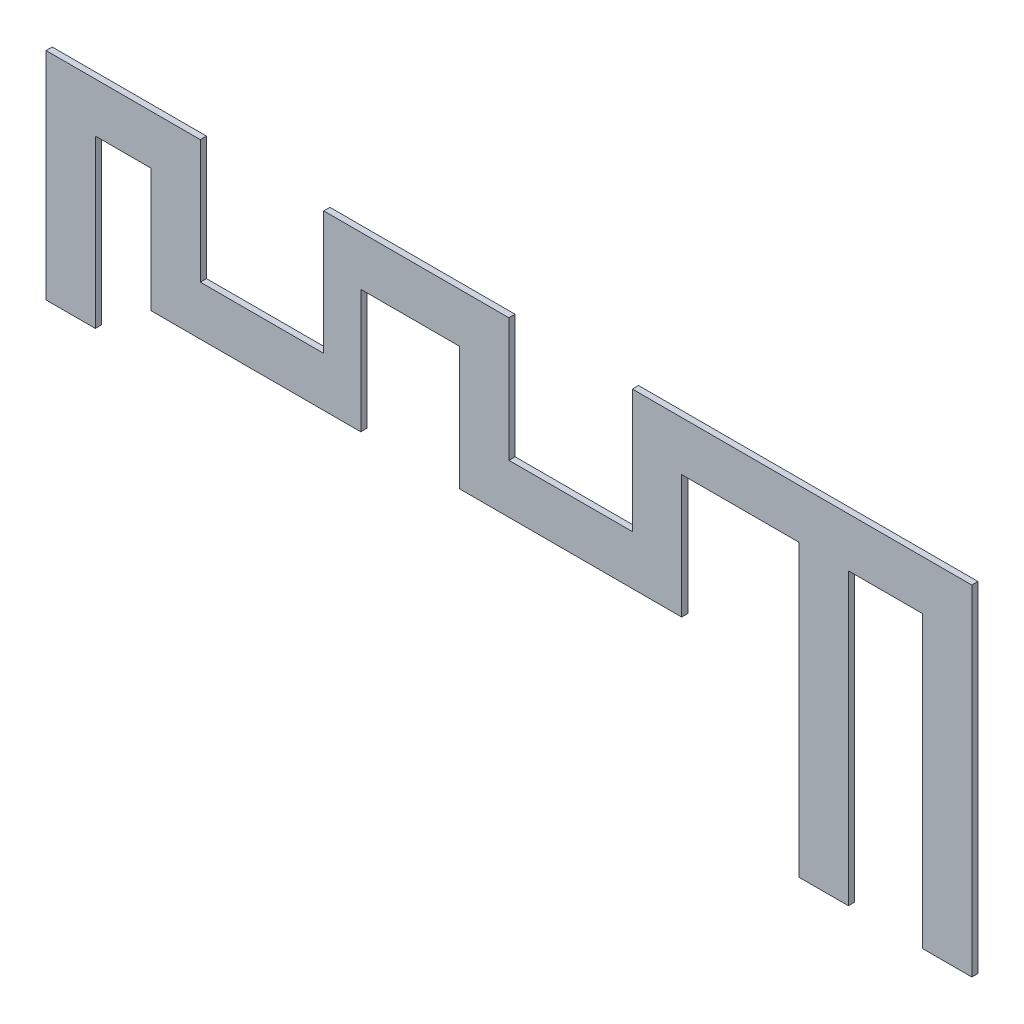
ISO-10303-21;
HEADER;
FILE_DESCRIPTION(('STEP AP214'),'2;1');
FILE_NAME('part.step','',(''),(''),'','','');
FILE_SCHEMA(('AUTOMOTIVE_DESIGN { 1 0 10303 214 1 1 1 1 }'));
ENDSEC;
DATA;
#1=APPLICATION_CONTEXT('core data for automotive mechanical design processes');
#2=APPLICATION_PROTOCOL_DEFINITION('international standard','automotive_design',2000,#1);
#3=PRODUCT_CONTEXT('',#1,'mechanical');
#4=PRODUCT('Part','Part','',(#3));
#5=PRODUCT_RELATED_PRODUCT_CATEGORY('part','',(#4));
#6=PRODUCT_DEFINITION_FORMATION('','',#4);
#7=PRODUCT_DEFINITION_CONTEXT('part definition',#1,'design');
#8=PRODUCT_DEFINITION('design','',#6,#7);
#9=PRODUCT_DEFINITION_SHAPE('','',#8);
#10=(LENGTH_UNIT() NAMED_UNIT(*) SI_UNIT(.MILLI.,.METRE.));
#11=(NAMED_UNIT(*) PLANE_ANGLE_UNIT() SI_UNIT($,.RADIAN.));
#12=(NAMED_UNIT(*) SI_UNIT($,.STERADIAN.) SOLID_ANGLE_UNIT());
#13=UNCERTAINTY_MEASURE_WITH_UNIT(LENGTH_MEASURE(1.E-05),#10,'distance_accuracy_value','');
#14=(GEOMETRIC_REPRESENTATION_CONTEXT(3) GLOBAL_UNCERTAINTY_ASSIGNED_CONTEXT((#13)) GLOBAL_UNIT_ASSIGNED_CONTEXT((#10,
#11,#12)) REPRESENTATION_CONTEXT('',''));
#15=CARTESIAN_POINT('',(0.,0.,0.));
#16=DIRECTION('',(0.,0.,1.));
#17=DIRECTION('',(1.,0.,0.));
#18=AXIS2_PLACEMENT_3D('',#15,#16,#17);
#19=CARTESIAN_POINT('',(14.899999666959,29.5999993383884,0.8));
#20=DIRECTION('',(-1.,0.,0.));
#21=DIRECTION('',(0.,-1.,0.));
#22=AXIS2_PLACEMENT_3D('',#19,#20,#21);
#23=PLANE('',#22);
#24=DIRECTION('',(0.,1.,0.));
#25=VECTOR('',#24,1.);
#26=CARTESIAN_POINT('',(14.899999666959,24.8999994434416,0.8));
#27=LINE('',#26,#25);
#28=CARTESIAN_POINT('',(14.899999666959,24.8999994434416,0.8));
#29=VERTEX_POINT('',#28);
#30=CARTESIAN_POINT('',(14.899999666959,29.5999993383884,0.8));
#31=VERTEX_POINT('',#30);
#32=EDGE_CURVE('E11',#29,#31,#27,.T.);
#33=ORIENTED_EDGE('',*,*,#32,.F.);
#34=DIRECTION('',(0.,0.,1.));
#35=VECTOR('',#34,1.);
#36=CARTESIAN_POINT('',(14.899999666959,24.8999994434416,0.8));
#37=LINE('',#36,#35);
#38=CARTESIAN_POINT('',(14.899999666959,24.8999994434416,0.9));
#39=VERTEX_POINT('',#38);
#40=EDGE_CURVE('E24',#29,#39,#37,.T.);
#41=ORIENTED_EDGE('',*,*,#40,.T.);
#42=DIRECTION('',(0.,-1.,0.));
#43=VECTOR('',#42,1.);
#44=CARTESIAN_POINT('',(14.899999666959,24.8999994434416,0.9));
#45=LINE('',#44,#43);
#46=CARTESIAN_POINT('',(14.899999666959,29.5999993383884,0.9));
#47=VERTEX_POINT('',#46);
#48=EDGE_CURVE('E223',#47,#39,#45,.T.);
#49=ORIENTED_EDGE('',*,*,#48,.F.);
#50=DIRECTION('',(0.,0.,1.));
#51=VECTOR('',#50,1.);
#52=CARTESIAN_POINT('',(14.899999666959,29.5999993383884,0.8));
#53=LINE('',#52,#51);
#54=EDGE_CURVE('E441',#31,#47,#53,.T.);
#55=ORIENTED_EDGE('',*,*,#54,.F.);
#56=EDGE_LOOP('',(#33,#41,#49,#55));
#57=FACE_BOUND('',#56,.T.);
#58=ADVANCED_FACE('F17',(#57),#23,.T.);
#59=CARTESIAN_POINT('',(13.6999996937811,29.5999993383884,0.8));
#60=DIRECTION('',(0.,-1.,0.));
#61=DIRECTION('',(1.,0.,0.));
#62=AXIS2_PLACEMENT_3D('',#59,#60,#61);
#63=PLANE('',#62);
#64=DIRECTION('',(-1.,0.,0.));
#65=VECTOR('',#64,1.);
#66=CARTESIAN_POINT('',(14.899999666959,29.5999993383884,0.8));
#67=LINE('',#66,#65);
#68=CARTESIAN_POINT('',(13.6999996937811,29.5999993383884,0.8));
#69=VERTEX_POINT('',#68);
#70=EDGE_CURVE('E439',#31,#69,#67,.T.);
#71=ORIENTED_EDGE('',*,*,#70,.F.);
#72=ORIENTED_EDGE('',*,*,#54,.T.);
#73=DIRECTION('',(1.,0.,0.));
#74=VECTOR('',#73,1.);
#75=CARTESIAN_POINT('',(14.899999666959,29.5999993383884,0.9));
#76=LINE('',#75,#74);
#77=CARTESIAN_POINT('',(13.6999996937811,29.5999993383884,0.9));
#78=VERTEX_POINT('',#77);
#79=EDGE_CURVE('E437',#78,#47,#76,.T.);
#80=ORIENTED_EDGE('',*,*,#79,.F.);
#81=DIRECTION('',(0.,0.,1.));
#82=VECTOR('',#81,1.);
#83=CARTESIAN_POINT('',(13.6999996937811,29.5999993383884,0.8));
#84=LINE('',#83,#82);
#85=EDGE_CURVE('E434',#69,#78,#84,.T.);
#86=ORIENTED_EDGE('',*,*,#85,.F.);
#87=EDGE_LOOP('',(#71,#72,#80,#86));
#88=FACE_BOUND('',#87,.T.);
#89=ADVANCED_FACE('F534',(#88),#63,.T.);
#90=CARTESIAN_POINT('',(13.6999996937811,24.8999994434416,0.8));
#91=DIRECTION('',(1.,0.,0.));
#92=DIRECTION('',(0.,1.,0.));
#93=AXIS2_PLACEMENT_3D('',#90,#91,#92);
#94=PLANE('',#93);
#95=DIRECTION('',(0.,-1.,0.));
#96=VECTOR('',#95,1.);
#97=CARTESIAN_POINT('',(13.6999996937811,29.5999993383884,0.8));
#98=LINE('',#97,#96);
#99=CARTESIAN_POINT('',(13.6999996937811,24.8999994434416,0.8));
#100=VERTEX_POINT('',#99);
#101=EDGE_CURVE('E432',#69,#100,#98,.T.);
#102=ORIENTED_EDGE('',*,*,#101,.F.);
#103=ORIENTED_EDGE('',*,*,#85,.T.);
#104=DIRECTION('',(0.,1.,0.));
#105=VECTOR('',#104,1.);
#106=CARTESIAN_POINT('',(13.6999996937811,29.5999993383884,0.9));
#107=LINE('',#106,#105);
#108=CARTESIAN_POINT('',(13.6999996937811,24.8999994434416,0.9));
#109=VERTEX_POINT('',#108);
#110=EDGE_CURVE('E429',#109,#78,#107,.T.);
#111=ORIENTED_EDGE('',*,*,#110,.F.);
#112=DIRECTION('',(0.,0.,1.));
#113=VECTOR('',#112,1.);
#114=CARTESIAN_POINT('',(13.6999996937811,24.8999994434416,0.8));
#115=LINE('',#114,#113);
#116=EDGE_CURVE('E426',#100,#109,#115,.T.);
#117=ORIENTED_EDGE('',*,*,#116,.F.);
#118=EDGE_LOOP('',(#102,#103,#111,#117));
#119=FACE_BOUND('',#118,.T.);
#120=ADVANCED_FACE('F530',(#119),#94,.T.);
#121=CARTESIAN_POINT('',(12.8999997116625,24.8999994434416,0.8));
#122=DIRECTION('',(0.,-1.,0.));
#123=DIRECTION('',(1.,0.,0.));
#124=AXIS2_PLACEMENT_3D('',#121,#122,#123);
#125=PLANE('',#124);
#126=DIRECTION('',(-1.,0.,0.));
#127=VECTOR('',#126,1.);
#128=CARTESIAN_POINT('',(13.6999996937811,24.8999994434416,0.8));
#129=LINE('',#128,#127);
#130=CARTESIAN_POINT('',(12.8999997116625,24.8999994434416,0.8));
#131=VERTEX_POINT('',#130);
#132=EDGE_CURVE('E423',#100,#131,#129,.T.);
#133=ORIENTED_EDGE('',*,*,#132,.F.);
#134=ORIENTED_EDGE('',*,*,#116,.T.);
#135=DIRECTION('',(1.,0.,0.));
#136=VECTOR('',#135,1.);
#137=CARTESIAN_POINT('',(13.6999996937811,24.8999994434416,0.9));
#138=LINE('',#137,#136);
#139=CARTESIAN_POINT('',(12.8999997116625,24.8999994434416,0.9));
#140=VERTEX_POINT('',#139);
#141=EDGE_CURVE('E419',#140,#109,#138,.T.);
#142=ORIENTED_EDGE('',*,*,#141,.F.);
#143=DIRECTION('',(0.,0.,1.));
#144=VECTOR('',#143,1.);
#145=CARTESIAN_POINT('',(12.8999997116625,24.8999994434416,0.8));
#146=LINE('',#145,#144);
#147=EDGE_CURVE('E415',#131,#140,#146,.T.);
#148=ORIENTED_EDGE('',*,*,#147,.F.);
#149=EDGE_LOOP('',(#133,#134,#142,#148));
#150=FACE_BOUND('',#149,.T.);
#151=ADVANCED_FACE('F526',(#150),#125,.T.);
#152=CARTESIAN_POINT('',(12.8999997116625,29.5999993383884,0.8));
#153=DIRECTION('',(-1.,0.,0.));
#154=DIRECTION('',(0.,-1.,0.));
#155=AXIS2_PLACEMENT_3D('',#152,#153,#154);
#156=PLANE('',#155);
#157=DIRECTION('',(0.,1.,0.));
#158=VECTOR('',#157,1.);
#159=CARTESIAN_POINT('',(12.8999997116625,24.8999994434416,0.8));
#160=LINE('',#159,#158);
#161=CARTESIAN_POINT('',(12.8999997116625,29.5999993383884,0.8));
#162=VERTEX_POINT('',#161);
#163=EDGE_CURVE('E412',#131,#162,#160,.T.);
#164=ORIENTED_EDGE('',*,*,#163,.F.);
#165=ORIENTED_EDGE('',*,*,#147,.T.);
#166=DIRECTION('',(0.,-1.,0.));
#167=VECTOR('',#166,1.);
#168=CARTESIAN_POINT('',(12.8999997116625,24.8999994434416,0.9));
#169=LINE('',#168,#167);
#170=CARTESIAN_POINT('',(12.8999997116625,29.5999993383884,0.9));
#171=VERTEX_POINT('',#170);
#172=EDGE_CURVE('E408',#171,#140,#169,.T.);
#173=ORIENTED_EDGE('',*,*,#172,.F.);
#174=DIRECTION('',(0.,0.,1.));
#175=VECTOR('',#174,1.);
#176=CARTESIAN_POINT('',(12.8999997116625,29.5999993383884,0.8));
#177=LINE('',#176,#175);
#178=EDGE_CURVE('E404',#162,#171,#177,.T.);
#179=ORIENTED_EDGE('',*,*,#178,.F.);
#180=EDGE_LOOP('',(#164,#165,#173,#179));
#181=FACE_BOUND('',#180,.T.);
#182=ADVANCED_FACE('F522',(#181),#156,.T.);
#183=CARTESIAN_POINT('',(10.9999997541308,29.5999993383884,0.8));
#184=DIRECTION('',(0.,-1.,0.));
#185=DIRECTION('',(1.,0.,0.));
#186=AXIS2_PLACEMENT_3D('',#183,#184,#185);
#187=PLANE('',#186);
#188=DIRECTION('',(-1.,0.,0.));
#189=VECTOR('',#188,1.);
#190=CARTESIAN_POINT('',(12.8999997116625,29.5999993383884,0.8));
#191=LINE('',#190,#189);
#192=CARTESIAN_POINT('',(10.9999997541308,29.5999993383884,0.8));
#193=VERTEX_POINT('',#192);
#194=EDGE_CURVE('E402',#162,#193,#191,.T.);
#195=ORIENTED_EDGE('',*,*,#194,.F.);
#196=ORIENTED_EDGE('',*,*,#178,.T.);
#197=DIRECTION('',(1.,0.,0.));
#198=VECTOR('',#197,1.);
#199=CARTESIAN_POINT('',(12.8999997116625,29.5999993383884,0.9));
#200=LINE('',#199,#198);
#201=CARTESIAN_POINT('',(10.9999997541308,29.5999993383884,0.9));
#202=VERTEX_POINT('',#201);
#203=EDGE_CURVE('E398',#202,#171,#200,.T.);
#204=ORIENTED_EDGE('',*,*,#203,.F.);
#205=DIRECTION('',(0.,0.,1.));
#206=VECTOR('',#205,1.);
#207=CARTESIAN_POINT('',(10.9999997541308,29.5999993383884,0.8));
#208=LINE('',#207,#206);
#209=EDGE_CURVE('E395',#193,#202,#208,.T.);
#210=ORIENTED_EDGE('',*,*,#209,.F.);
#211=EDGE_LOOP('',(#195,#196,#204,#210));
#212=FACE_BOUND('',#211,.T.);
#213=ADVANCED_FACE('F518',(#212),#187,.T.);
#214=CARTESIAN_POINT('',(10.9999997541308,27.5999993830919,0.8));
#215=DIRECTION('',(1.,0.,0.));
#216=DIRECTION('',(0.,1.,0.));
#217=AXIS2_PLACEMENT_3D('',#214,#215,#216);
#218=PLANE('',#217);
#219=DIRECTION('',(0.,-1.,0.));
#220=VECTOR('',#219,1.);
#221=CARTESIAN_POINT('',(10.9999997541308,29.5999993383884,0.8));
#222=LINE('',#221,#220);
#223=CARTESIAN_POINT('',(10.9999997541308,27.5999993830919,0.8));
#224=VERTEX_POINT('',#223);
#225=EDGE_CURVE('E393',#193,#224,#222,.T.);
#226=ORIENTED_EDGE('',*,*,#225,.F.);
#227=ORIENTED_EDGE('',*,*,#209,.T.);
#228=DIRECTION('',(0.,1.,0.));
#229=VECTOR('',#228,1.);
#230=CARTESIAN_POINT('',(10.9999997541308,29.5999993383884,0.9));
#231=LINE('',#230,#229);
#232=CARTESIAN_POINT('',(10.9999997541308,27.5999993830919,0.9));
#233=VERTEX_POINT('',#232);
#234=EDGE_CURVE('E390',#233,#202,#231,.T.);
#235=ORIENTED_EDGE('',*,*,#234,.F.);
#236=DIRECTION('',(0.,0.,1.));
#237=VECTOR('',#236,1.);
#238=CARTESIAN_POINT('',(10.9999997541308,27.5999993830919,0.8));
#239=LINE('',#238,#237);
#240=EDGE_CURVE('E387',#224,#233,#239,.T.);
#241=ORIENTED_EDGE('',*,*,#240,.F.);
#242=EDGE_LOOP('',(#226,#227,#235,#241));
#243=FACE_BOUND('',#242,.T.);
#244=ADVANCED_FACE('F514',(#243),#218,.T.);
#245=CARTESIAN_POINT('',(7.39999983459711,27.5999993830919,0.8));
#246=DIRECTION('',(0.,-1.,0.));
#247=DIRECTION('',(1.,0.,0.));
#248=AXIS2_PLACEMENT_3D('',#245,#246,#247);
#249=PLANE('',#248);
#250=DIRECTION('',(-1.,0.,0.));
#251=VECTOR('',#250,1.);
#252=CARTESIAN_POINT('',(10.9999997541308,27.5999993830919,0.8));
#253=LINE('',#252,#251);
#254=CARTESIAN_POINT('',(7.39999983459711,27.5999993830919,0.8));
#255=VERTEX_POINT('',#254);
#256=EDGE_CURVE('E385',#224,#255,#253,.T.);
#257=ORIENTED_EDGE('',*,*,#256,.F.);
#258=ORIENTED_EDGE('',*,*,#240,.T.);
#259=DIRECTION('',(1.,0.,0.));
#260=VECTOR('',#259,1.);
#261=CARTESIAN_POINT('',(10.9999997541308,27.5999993830919,0.9));
#262=LINE('',#261,#260);
#263=CARTESIAN_POINT('',(7.39999983459711,27.5999993830919,0.9));
#264=VERTEX_POINT('',#263);
#265=EDGE_CURVE('E382',#264,#233,#262,.T.);
#266=ORIENTED_EDGE('',*,*,#265,.F.);
#267=DIRECTION('',(0.,0.,1.));
#268=VECTOR('',#267,1.);
#269=CARTESIAN_POINT('',(7.39999983459711,27.5999993830919,0.8));
#270=LINE('',#269,#268);
#271=EDGE_CURVE('E379',#255,#264,#270,.T.);
#272=ORIENTED_EDGE('',*,*,#271,.F.);
#273=EDGE_LOOP('',(#257,#258,#266,#272));
#274=FACE_BOUND('',#273,.T.);
#275=ADVANCED_FACE('F510',(#274),#249,.T.);
#276=CARTESIAN_POINT('',(7.39999983459711,29.5999993383884,0.8));
#277=DIRECTION('',(-1.,0.,0.));
#278=DIRECTION('',(0.,-1.,0.));
#279=AXIS2_PLACEMENT_3D('',#276,#277,#278);
#280=PLANE('',#279);
#281=DIRECTION('',(0.,1.,0.));
#282=VECTOR('',#281,1.);
#283=CARTESIAN_POINT('',(7.39999983459711,27.5999993830919,0.8));
#284=LINE('',#283,#282);
#285=CARTESIAN_POINT('',(7.39999983459711,29.5999993383884,0.8));
#286=VERTEX_POINT('',#285);
#287=EDGE_CURVE('E377',#255,#286,#284,.T.);
#288=ORIENTED_EDGE('',*,*,#287,.F.);
#289=ORIENTED_EDGE('',*,*,#271,.T.);
#290=DIRECTION('',(0.,-1.,0.));
#291=VECTOR('',#290,1.);
#292=CARTESIAN_POINT('',(7.39999983459711,27.5999993830919,0.9));
#293=LINE('',#292,#291);
#294=CARTESIAN_POINT('',(7.39999983459711,29.5999993383884,0.9));
#295=VERTEX_POINT('',#294);
#296=EDGE_CURVE('E374',#295,#264,#293,.T.);
#297=ORIENTED_EDGE('',*,*,#296,.F.);
#298=DIRECTION('',(0.,0.,1.));
#299=VECTOR('',#298,1.);
#300=CARTESIAN_POINT('',(7.39999983459711,29.5999993383884,0.8));
#301=LINE('',#300,#299);
#302=EDGE_CURVE('E371',#286,#295,#301,.T.);
#303=ORIENTED_EDGE('',*,*,#302,.F.);
#304=EDGE_LOOP('',(#288,#289,#297,#303));
#305=FACE_BOUND('',#304,.T.);
#306=ADVANCED_FACE('F506',(#305),#280,.T.);
#307=CARTESIAN_POINT('',(5.7999998703599,29.5999993383884,0.8));
#308=DIRECTION('',(0.,-1.,0.));
#309=DIRECTION('',(1.,0.,0.));
#310=AXIS2_PLACEMENT_3D('',#307,#308,#309);
#311=PLANE('',#310);
#312=DIRECTION('',(-1.,0.,0.));
#313=VECTOR('',#312,1.);
#314=CARTESIAN_POINT('',(7.39999983459711,29.5999993383884,0.8));
#315=LINE('',#314,#313);
#316=CARTESIAN_POINT('',(5.7999998703599,29.5999993383884,0.8));
#317=VERTEX_POINT('',#316);
#318=EDGE_CURVE('E369',#286,#317,#315,.T.);
#319=ORIENTED_EDGE('',*,*,#318,.F.);
#320=ORIENTED_EDGE('',*,*,#302,.T.);
#321=DIRECTION('',(1.,0.,0.));
#322=VECTOR('',#321,1.);
#323=CARTESIAN_POINT('',(7.39999983459711,29.5999993383884,0.9));
#324=LINE('',#323,#322);
#325=CARTESIAN_POINT('',(5.7999998703599,29.5999993383884,0.9));
#326=VERTEX_POINT('',#325);
#327=EDGE_CURVE('E366',#326,#295,#324,.T.);
#328=ORIENTED_EDGE('',*,*,#327,.F.);
#329=DIRECTION('',(0.,0.,1.));
#330=VECTOR('',#329,1.);
#331=CARTESIAN_POINT('',(5.7999998703599,29.5999993383884,0.8));
#332=LINE('',#331,#330);
#333=EDGE_CURVE('E363',#317,#326,#332,.T.);
#334=ORIENTED_EDGE('',*,*,#333,.F.);
#335=EDGE_LOOP('',(#319,#320,#328,#334));
#336=FACE_BOUND('',#335,.T.);
#337=ADVANCED_FACE('F502',(#336),#311,.T.);
#338=CARTESIAN_POINT('',(5.7999998703599,27.5999993830919,0.8));
#339=DIRECTION('',(1.,0.,0.));
#340=DIRECTION('',(0.,1.,0.));
#341=AXIS2_PLACEMENT_3D('',#338,#339,#340);
#342=PLANE('',#341);
#343=DIRECTION('',(0.,-1.,0.));
#344=VECTOR('',#343,1.);
#345=CARTESIAN_POINT('',(5.7999998703599,29.5999993383884,0.8));
#346=LINE('',#345,#344);
#347=CARTESIAN_POINT('',(5.7999998703599,27.5999993830919,0.8));
#348=VERTEX_POINT('',#347);
#349=EDGE_CURVE('E361',#317,#348,#346,.T.);
#350=ORIENTED_EDGE('',*,*,#349,.F.);
#351=ORIENTED_EDGE('',*,*,#333,.T.);
#352=DIRECTION('',(0.,1.,0.));
#353=VECTOR('',#352,1.);
#354=CARTESIAN_POINT('',(5.7999998703599,29.5999993383884,0.9));
#355=LINE('',#354,#353);
#356=CARTESIAN_POINT('',(5.7999998703599,27.5999993830919,0.9));
#357=VERTEX_POINT('',#356);
#358=EDGE_CURVE('E358',#357,#326,#355,.T.);
#359=ORIENTED_EDGE('',*,*,#358,.F.);
#360=DIRECTION('',(0.,0.,1.));
#361=VECTOR('',#360,1.);
#362=CARTESIAN_POINT('',(5.7999998703599,27.5999993830919,0.8));
#363=LINE('',#362,#361);
#364=EDGE_CURVE('E355',#348,#357,#363,.T.);
#365=ORIENTED_EDGE('',*,*,#364,.F.);
#366=EDGE_LOOP('',(#350,#351,#359,#365));
#367=FACE_BOUND('',#366,.T.);
#368=ADVANCED_FACE('F498',(#367),#342,.T.);
#369=CARTESIAN_POINT('',(2.39999994635582,27.5999993830919,0.8));
#370=DIRECTION('',(0.,-1.,0.));
#371=DIRECTION('',(1.,0.,0.));
#372=AXIS2_PLACEMENT_3D('',#369,#370,#371);
#373=PLANE('',#372);
#374=DIRECTION('',(-1.,0.,0.));
#375=VECTOR('',#374,1.);
#376=CARTESIAN_POINT('',(5.7999998703599,27.5999993830919,0.8));
#377=LINE('',#376,#375);
#378=CARTESIAN_POINT('',(2.39999994635582,27.5999993830919,0.8));
#379=VERTEX_POINT('',#378);
#380=EDGE_CURVE('E353',#348,#379,#377,.T.);
#381=ORIENTED_EDGE('',*,*,#380,.F.);
#382=ORIENTED_EDGE('',*,*,#364,.T.);
#383=DIRECTION('',(1.,0.,0.));
#384=VECTOR('',#383,1.);
#385=CARTESIAN_POINT('',(5.7999998703599,27.5999993830919,0.9));
#386=LINE('',#385,#384);
#387=CARTESIAN_POINT('',(2.39999994635582,27.5999993830919,0.9));
#388=VERTEX_POINT('',#387);
#389=EDGE_CURVE('E350',#388,#357,#386,.T.);
#390=ORIENTED_EDGE('',*,*,#389,.F.);
#391=DIRECTION('',(0.,0.,1.));
#392=VECTOR('',#391,1.);
#393=CARTESIAN_POINT('',(2.39999994635582,27.5999993830919,0.8));
#394=LINE('',#393,#392);
#395=EDGE_CURVE('E347',#379,#388,#394,.T.);
#396=ORIENTED_EDGE('',*,*,#395,.F.);
#397=EDGE_LOOP('',(#381,#382,#390,#396));
#398=FACE_BOUND('',#397,.T.);
#399=ADVANCED_FACE('F494',(#398),#373,.T.);
#400=CARTESIAN_POINT('',(2.39999994635582,29.5999993383884,0.8));
#401=DIRECTION('',(-1.,0.,0.));
#402=DIRECTION('',(0.,-1.,0.));
#403=AXIS2_PLACEMENT_3D('',#400,#401,#402);
#404=PLANE('',#403);
#405=DIRECTION('',(0.,1.,0.));
#406=VECTOR('',#405,1.);
#407=CARTESIAN_POINT('',(2.39999994635582,27.5999993830919,0.8));
#408=LINE('',#407,#406);
#409=CARTESIAN_POINT('',(2.39999994635582,29.5999993383884,0.8));
#410=VERTEX_POINT('',#409);
#411=EDGE_CURVE('E345',#379,#410,#408,.T.);
#412=ORIENTED_EDGE('',*,*,#411,.F.);
#413=ORIENTED_EDGE('',*,*,#395,.T.);
#414=DIRECTION('',(0.,-1.,0.));
#415=VECTOR('',#414,1.);
#416=CARTESIAN_POINT('',(2.39999994635582,27.5999993830919,0.9));
#417=LINE('',#416,#415);
#418=CARTESIAN_POINT('',(2.39999994635582,29.5999993383884,0.9));
#419=VERTEX_POINT('',#418);
#420=EDGE_CURVE('E342',#419,#388,#417,.T.);
#421=ORIENTED_EDGE('',*,*,#420,.F.);
#422=DIRECTION('',(0.,0.,1.));
#423=VECTOR('',#422,1.);
#424=CARTESIAN_POINT('',(2.39999994635582,29.5999993383884,0.8));
#425=LINE('',#424,#423);
#426=EDGE_CURVE('E339',#410,#419,#425,.T.);
#427=ORIENTED_EDGE('',*,*,#426,.F.);
#428=EDGE_LOOP('',(#412,#413,#421,#427));
#429=FACE_BOUND('',#428,.T.);
#430=ADVANCED_FACE('F490',(#429),#404,.T.);
#431=CARTESIAN_POINT('',(1.49999996647239,29.5999993383884,0.8));
#432=DIRECTION('',(0.,-1.,0.));
#433=DIRECTION('',(1.,0.,0.));
#434=AXIS2_PLACEMENT_3D('',#431,#432,#433);
#435=PLANE('',#434);
#436=DIRECTION('',(-1.,0.,0.));
#437=VECTOR('',#436,1.);
#438=CARTESIAN_POINT('',(2.39999994635582,29.5999993383884,0.8));
#439=LINE('',#438,#437);
#440=CARTESIAN_POINT('',(1.49999996647239,29.5999993383884,0.8));
#441=VERTEX_POINT('',#440);
#442=EDGE_CURVE('E337',#410,#441,#439,.T.);
#443=ORIENTED_EDGE('',*,*,#442,.F.);
#444=ORIENTED_EDGE('',*,*,#426,.T.);
#445=DIRECTION('',(1.,0.,0.));
#446=VECTOR('',#445,1.);
#447=CARTESIAN_POINT('',(2.39999994635582,29.5999993383884,0.9));
#448=LINE('',#447,#446);
#449=CARTESIAN_POINT('',(1.49999996647239,29.5999993383884,0.9));
#450=VERTEX_POINT('',#449);
#451=EDGE_CURVE('E334',#450,#419,#448,.T.);
#452=ORIENTED_EDGE('',*,*,#451,.F.);
#453=DIRECTION('',(0.,0.,1.));
#454=VECTOR('',#453,1.);
#455=CARTESIAN_POINT('',(1.49999996647239,29.5999993383884,0.8));
#456=LINE('',#455,#454);
#457=EDGE_CURVE('E331',#441,#450,#456,.T.);
#458=ORIENTED_EDGE('',*,*,#457,.F.);
#459=EDGE_LOOP('',(#443,#444,#452,#458));
#460=FACE_BOUND('',#459,.T.);
#461=ADVANCED_FACE('F486',(#460),#435,.T.);
#462=CARTESIAN_POINT('',(1.49999996647239,26.8999993987381,0.8));
#463=DIRECTION('',(1.,0.,0.));
#464=DIRECTION('',(0.,1.,0.));
#465=AXIS2_PLACEMENT_3D('',#462,#463,#464);
#466=PLANE('',#465);
#467=DIRECTION('',(0.,-1.,0.));
#468=VECTOR('',#467,1.);
#469=CARTESIAN_POINT('',(1.49999996647239,29.5999993383884,0.8));
#470=LINE('',#469,#468);
#471=CARTESIAN_POINT('',(1.49999996647239,26.8999993987381,0.8));
#472=VERTEX_POINT('',#471);
#473=EDGE_CURVE('E329',#441,#472,#470,.T.);
#474=ORIENTED_EDGE('',*,*,#473,.F.);
#475=ORIENTED_EDGE('',*,*,#457,.T.);
#476=DIRECTION('',(0.,1.,0.));
#477=VECTOR('',#476,1.);
#478=CARTESIAN_POINT('',(1.49999996647239,29.5999993383884,0.9));
#479=LINE('',#478,#477);
#480=CARTESIAN_POINT('',(1.49999996647239,26.8999993987381,0.9));
#481=VERTEX_POINT('',#480);
#482=EDGE_CURVE('E326',#481,#450,#479,.T.);
#483=ORIENTED_EDGE('',*,*,#482,.F.);
#484=DIRECTION('',(0.,0.,1.));
#485=VECTOR('',#484,1.);
#486=CARTESIAN_POINT('',(1.49999996647239,26.8999993987381,0.8));
#487=LINE('',#486,#485);
#488=EDGE_CURVE('E323',#472,#481,#487,.T.);
#489=ORIENTED_EDGE('',*,*,#488,.F.);
#490=EDGE_LOOP('',(#474,#475,#483,#489));
#491=FACE_BOUND('',#490,.T.);
#492=ADVANCED_FACE('F482',(#491),#466,.T.);
#493=CARTESIAN_POINT('',(0.699999984353781,26.8999993987381,0.8));
#494=DIRECTION('',(0.,-1.,0.));
#495=DIRECTION('',(1.,0.,0.));
#496=AXIS2_PLACEMENT_3D('',#493,#494,#495);
#497=PLANE('',#496);
#498=DIRECTION('',(-1.,0.,0.));
#499=VECTOR('',#498,1.);
#500=CARTESIAN_POINT('',(1.49999996647239,26.8999993987381,0.8));
#501=LINE('',#500,#499);
#502=CARTESIAN_POINT('',(0.699999984353781,26.8999993987381,0.8));
#503=VERTEX_POINT('',#502);
#504=EDGE_CURVE('E321',#472,#503,#501,.T.);
#505=ORIENTED_EDGE('',*,*,#504,.F.);
#506=ORIENTED_EDGE('',*,*,#488,.T.);
#507=DIRECTION('',(1.,0.,0.));
#508=VECTOR('',#507,1.);
#509=CARTESIAN_POINT('',(1.49999996647239,26.8999993987381,0.9));
#510=LINE('',#509,#508);
#511=CARTESIAN_POINT('',(0.699999984353781,26.8999993987381,0.9));
#512=VERTEX_POINT('',#511);
#513=EDGE_CURVE('E318',#512,#481,#510,.T.);
#514=ORIENTED_EDGE('',*,*,#513,.F.);
#515=DIRECTION('',(0.,0.,1.));
#516=VECTOR('',#515,1.);
#517=CARTESIAN_POINT('',(0.699999984353781,26.8999993987381,0.8));
#518=LINE('',#517,#516);
#519=EDGE_CURVE('E315',#503,#512,#518,.T.);
#520=ORIENTED_EDGE('',*,*,#519,.F.);
#521=EDGE_LOOP('',(#505,#506,#514,#520));
#522=FACE_BOUND('',#521,.T.);
#523=ADVANCED_FACE('F478',(#522),#497,.T.);
#524=CARTESIAN_POINT('',(0.699999984353781,30.399999320507,0.8));
#525=DIRECTION('',(-1.,0.,0.));
#526=DIRECTION('',(0.,-1.,0.));
#527=AXIS2_PLACEMENT_3D('',#524,#525,#526);
#528=PLANE('',#527);
#529=DIRECTION('',(0.,1.,0.));
#530=VECTOR('',#529,1.);
#531=CARTESIAN_POINT('',(0.699999984353781,26.8999993987381,0.8));
#532=LINE('',#531,#530);
#533=CARTESIAN_POINT('',(0.699999984353781,30.399999320507,0.8));
#534=VERTEX_POINT('',#533);
#535=EDGE_CURVE('E313',#503,#534,#532,.T.);
#536=ORIENTED_EDGE('',*,*,#535,.F.);
#537=ORIENTED_EDGE('',*,*,#519,.T.);
#538=DIRECTION('',(0.,-1.,0.));
#539=VECTOR('',#538,1.);
#540=CARTESIAN_POINT('',(0.699999984353781,26.8999993987381,0.9));
#541=LINE('',#540,#539);
#542=CARTESIAN_POINT('',(0.699999984353781,30.399999320507,0.9));
#543=VERTEX_POINT('',#542);
#544=EDGE_CURVE('E310',#543,#512,#541,.T.);
#545=ORIENTED_EDGE('',*,*,#544,.F.);
#546=DIRECTION('',(0.,0.,1.));
#547=VECTOR('',#546,1.);
#548=CARTESIAN_POINT('',(0.699999984353781,30.399999320507,0.8));
#549=LINE('',#548,#547);
#550=EDGE_CURVE('E307',#534,#543,#549,.T.);
#551=ORIENTED_EDGE('',*,*,#550,.F.);
#552=EDGE_LOOP('',(#536,#537,#545,#551));
#553=FACE_BOUND('',#552,.T.);
#554=ADVANCED_FACE('F474',(#553),#528,.T.);
#555=CARTESIAN_POINT('',(3.19999992847443,30.399999320507,0.8));
#556=DIRECTION('',(0.,1.,0.));
#557=DIRECTION('',(-1.,0.,0.));
#558=AXIS2_PLACEMENT_3D('',#555,#556,#557);
#559=PLANE('',#558);
#560=DIRECTION('',(-1.,0.,0.));
#561=VECTOR('',#560,1.);
#562=CARTESIAN_POINT('',(3.19999992847443,30.399999320507,0.8));
#563=LINE('',#562,#561);
#564=CARTESIAN_POINT('',(3.19999992847443,30.399999320507,0.8));
#565=VERTEX_POINT('',#564);
#566=EDGE_CURVE('E304',#565,#534,#563,.T.);
#567=ORIENTED_EDGE('',*,*,#566,.T.);
#568=ORIENTED_EDGE('',*,*,#550,.T.);
#569=DIRECTION('',(-1.,0.,0.));
#570=VECTOR('',#569,1.);
#571=CARTESIAN_POINT('',(3.19999992847443,30.399999320507,0.9));
#572=LINE('',#571,#570);
#573=CARTESIAN_POINT('',(3.19999992847443,30.399999320507,0.9));
#574=VERTEX_POINT('',#573);
#575=EDGE_CURVE('E301',#574,#543,#572,.T.);
#576=ORIENTED_EDGE('',*,*,#575,.F.);
#577=DIRECTION('',(0.,0.,1.));
#578=VECTOR('',#577,1.);
#579=CARTESIAN_POINT('',(3.19999992847443,30.399999320507,0.8));
#580=LINE('',#579,#578);
#581=EDGE_CURVE('E298',#565,#574,#580,.T.);
#582=ORIENTED_EDGE('',*,*,#581,.F.);
#583=EDGE_LOOP('',(#567,#568,#576,#582));
#584=FACE_BOUND('',#583,.T.);
#585=ADVANCED_FACE('F470',(#584),#559,.T.);
#586=CARTESIAN_POINT('',(3.19999992847443,28.3999993652105,0.8));
#587=DIRECTION('',(1.,0.,0.));
#588=DIRECTION('',(0.,1.,0.));
#589=AXIS2_PLACEMENT_3D('',#586,#587,#588);
#590=PLANE('',#589);
#591=DIRECTION('',(0.,1.,0.));
#592=VECTOR('',#591,1.);
#593=CARTESIAN_POINT('',(3.19999992847443,28.3999993652105,0.8));
#594=LINE('',#593,#592);
#595=CARTESIAN_POINT('',(3.19999992847443,28.3999993652105,0.8));
#596=VERTEX_POINT('',#595);
#597=EDGE_CURVE('E295',#596,#565,#594,.T.);
#598=ORIENTED_EDGE('',*,*,#597,.T.);
#599=ORIENTED_EDGE('',*,*,#581,.T.);
#600=DIRECTION('',(0.,1.,0.));
#601=VECTOR('',#600,1.);
#602=CARTESIAN_POINT('',(3.19999992847443,28.3999993652105,0.9));
#603=LINE('',#602,#601);
#604=CARTESIAN_POINT('',(3.19999992847443,28.3999993652105,0.9));
#605=VERTEX_POINT('',#604);
#606=EDGE_CURVE('E292',#605,#574,#603,.T.);
#607=ORIENTED_EDGE('',*,*,#606,.F.);
#608=DIRECTION('',(0.,0.,1.));
#609=VECTOR('',#608,1.);
#610=CARTESIAN_POINT('',(3.19999992847443,28.3999993652105,0.8));
#611=LINE('',#610,#609);
#612=EDGE_CURVE('E289',#596,#605,#611,.T.);
#613=ORIENTED_EDGE('',*,*,#612,.F.);
#614=EDGE_LOOP('',(#598,#599,#607,#613));
#615=FACE_BOUND('',#614,.T.);
#616=ADVANCED_FACE('F467',(#615),#590,.T.);
#617=CARTESIAN_POINT('',(5.19999988377094,28.3999993652105,0.8));
#618=DIRECTION('',(0.,1.,0.));
#619=DIRECTION('',(-1.,0.,0.));
#620=AXIS2_PLACEMENT_3D('',#617,#618,#619);
#621=PLANE('',#620);
#622=DIRECTION('',(-1.,0.,0.));
#623=VECTOR('',#622,1.);
#624=CARTESIAN_POINT('',(5.19999988377094,28.3999993652105,0.8));
#625=LINE('',#624,#623);
#626=CARTESIAN_POINT('',(5.19999988377094,28.3999993652105,0.8));
#627=VERTEX_POINT('',#626);
#628=EDGE_CURVE('E286',#627,#596,#625,.T.);
#629=ORIENTED_EDGE('',*,*,#628,.T.);
#630=ORIENTED_EDGE('',*,*,#612,.T.);
#631=DIRECTION('',(-1.,0.,0.));
#632=VECTOR('',#631,1.);
#633=CARTESIAN_POINT('',(5.19999988377094,28.3999993652105,0.9));
#634=LINE('',#633,#632);
#635=CARTESIAN_POINT('',(5.19999988377094,28.3999993652105,0.9));
#636=VERTEX_POINT('',#635);
#637=EDGE_CURVE('E283',#636,#605,#634,.T.);
#638=ORIENTED_EDGE('',*,*,#637,.F.);
#639=DIRECTION('',(0.,0.,1.));
#640=VECTOR('',#639,1.);
#641=CARTESIAN_POINT('',(5.19999988377094,28.3999993652105,0.8));
#642=LINE('',#641,#640);
#643=EDGE_CURVE('E280',#627,#636,#642,.T.);
#644=ORIENTED_EDGE('',*,*,#643,.F.);
#645=EDGE_LOOP('',(#629,#630,#638,#644));
#646=FACE_BOUND('',#645,.T.);
#647=ADVANCED_FACE('F464',(#646),#621,.T.);
#648=CARTESIAN_POINT('',(5.19999988377094,30.399999320507,0.8));
#649=DIRECTION('',(-1.,0.,0.));
#650=DIRECTION('',(0.,-1.,0.));
#651=AXIS2_PLACEMENT_3D('',#648,#649,#650);
#652=PLANE('',#651);
#653=DIRECTION('',(0.,-1.,0.));
#654=VECTOR('',#653,1.);
#655=CARTESIAN_POINT('',(5.19999988377094,30.399999320507,0.8));
#656=LINE('',#655,#654);
#657=CARTESIAN_POINT('',(5.19999988377094,30.399999320507,0.8));
#658=VERTEX_POINT('',#657);
#659=EDGE_CURVE('E277',#658,#627,#656,.T.);
#660=ORIENTED_EDGE('',*,*,#659,.T.);
#661=ORIENTED_EDGE('',*,*,#643,.T.);
#662=DIRECTION('',(0.,-1.,0.));
#663=VECTOR('',#662,1.);
#664=CARTESIAN_POINT('',(5.19999988377094,30.399999320507,0.9));
#665=LINE('',#664,#663);
#666=CARTESIAN_POINT('',(5.19999988377094,30.399999320507,0.9));
#667=VERTEX_POINT('',#666);
#668=EDGE_CURVE('E274',#667,#636,#665,.T.);
#669=ORIENTED_EDGE('',*,*,#668,.F.);
#670=DIRECTION('',(0.,0.,1.));
#671=VECTOR('',#670,1.);
#672=CARTESIAN_POINT('',(5.19999988377094,30.399999320507,0.8));
#673=LINE('',#672,#671);
#674=EDGE_CURVE('E271',#658,#667,#673,.T.);
#675=ORIENTED_EDGE('',*,*,#674,.F.);
#676=EDGE_LOOP('',(#660,#661,#669,#675));
#677=FACE_BOUND('',#676,.T.);
#678=ADVANCED_FACE('F461',(#677),#652,.T.);
#679=CARTESIAN_POINT('',(8.19999981671572,30.399999320507,0.8));
#680=DIRECTION('',(0.,1.,0.));
#681=DIRECTION('',(-1.,0.,0.));
#682=AXIS2_PLACEMENT_3D('',#679,#680,#681);
#683=PLANE('',#682);
#684=DIRECTION('',(-1.,0.,0.));
#685=VECTOR('',#684,1.);
#686=CARTESIAN_POINT('',(8.19999981671572,30.399999320507,0.8));
#687=LINE('',#686,#685);
#688=CARTESIAN_POINT('',(8.19999981671572,30.399999320507,0.8));
#689=VERTEX_POINT('',#688);
#690=EDGE_CURVE('E268',#689,#658,#687,.T.);
#691=ORIENTED_EDGE('',*,*,#690,.T.);
#692=ORIENTED_EDGE('',*,*,#674,.T.);
#693=DIRECTION('',(-1.,0.,0.));
#694=VECTOR('',#693,1.);
#695=CARTESIAN_POINT('',(8.19999981671572,30.399999320507,0.9));
#696=LINE('',#695,#694);
#697=CARTESIAN_POINT('',(8.19999981671572,30.399999320507,0.9));
#698=VERTEX_POINT('',#697);
#699=EDGE_CURVE('E265',#698,#667,#696,.T.);
#700=ORIENTED_EDGE('',*,*,#699,.F.);
#701=DIRECTION('',(0.,0.,1.));
#702=VECTOR('',#701,1.);
#703=CARTESIAN_POINT('',(8.19999981671572,30.399999320507,0.8));
#704=LINE('',#703,#702);
#705=EDGE_CURVE('E262',#689,#698,#704,.T.);
#706=ORIENTED_EDGE('',*,*,#705,.F.);
#707=EDGE_LOOP('',(#691,#692,#700,#706));
#708=FACE_BOUND('',#707,.T.);
#709=ADVANCED_FACE('F458',(#708),#683,.T.);
#710=CARTESIAN_POINT('',(8.19999981671572,28.3999993652105,0.8));
#711=DIRECTION('',(1.,0.,0.));
#712=DIRECTION('',(0.,1.,0.));
#713=AXIS2_PLACEMENT_3D('',#710,#711,#712);
#714=PLANE('',#713);
#715=DIRECTION('',(0.,1.,0.));
#716=VECTOR('',#715,1.);
#717=CARTESIAN_POINT('',(8.19999981671572,28.3999993652105,0.8));
#718=LINE('',#717,#716);
#719=CARTESIAN_POINT('',(8.19999981671572,28.3999993652105,0.8));
#720=VERTEX_POINT('',#719);
#721=EDGE_CURVE('E259',#720,#689,#718,.T.);
#722=ORIENTED_EDGE('',*,*,#721,.T.);
#723=ORIENTED_EDGE('',*,*,#705,.T.);
#724=DIRECTION('',(0.,1.,0.));
#725=VECTOR('',#724,1.);
#726=CARTESIAN_POINT('',(8.19999981671572,28.3999993652105,0.9));
#727=LINE('',#726,#725);
#728=CARTESIAN_POINT('',(8.19999981671572,28.3999993652105,0.9));
#729=VERTEX_POINT('',#728);
#730=EDGE_CURVE('E256',#729,#698,#727,.T.);
#731=ORIENTED_EDGE('',*,*,#730,.F.);
#732=DIRECTION('',(0.,0.,1.));
#733=VECTOR('',#732,1.);
#734=CARTESIAN_POINT('',(8.19999981671572,28.3999993652105,0.8));
#735=LINE('',#734,#733);
#736=EDGE_CURVE('E253',#720,#729,#735,.T.);
#737=ORIENTED_EDGE('',*,*,#736,.F.);
#738=EDGE_LOOP('',(#722,#723,#731,#737));
#739=FACE_BOUND('',#738,.T.);
#740=ADVANCED_FACE('F455',(#739),#714,.T.);
#741=CARTESIAN_POINT('',(10.1999997720122,28.3999993652105,0.8));
#742=DIRECTION('',(0.,1.,0.));
#743=DIRECTION('',(-1.,0.,0.));
#744=AXIS2_PLACEMENT_3D('',#741,#742,#743);
#745=PLANE('',#744);
#746=DIRECTION('',(-1.,0.,0.));
#747=VECTOR('',#746,1.);
#748=CARTESIAN_POINT('',(10.1999997720122,28.3999993652105,0.8));
#749=LINE('',#748,#747);
#750=CARTESIAN_POINT('',(10.1999997720122,28.3999993652105,0.8));
#751=VERTEX_POINT('',#750);
#752=EDGE_CURVE('E250',#751,#720,#749,.T.);
#753=ORIENTED_EDGE('',*,*,#752,.T.);
#754=ORIENTED_EDGE('',*,*,#736,.T.);
#755=DIRECTION('',(-1.,0.,0.));
#756=VECTOR('',#755,1.);
#757=CARTESIAN_POINT('',(10.1999997720122,28.3999993652105,0.9));
#758=LINE('',#757,#756);
#759=CARTESIAN_POINT('',(10.1999997720122,28.3999993652105,0.9));
#760=VERTEX_POINT('',#759);
#761=EDGE_CURVE('E247',#760,#729,#758,.T.);
#762=ORIENTED_EDGE('',*,*,#761,.F.);
#763=DIRECTION('',(0.,0.,1.));
#764=VECTOR('',#763,1.);
#765=CARTESIAN_POINT('',(10.1999997720122,28.3999993652105,0.8));
#766=LINE('',#765,#764);
#767=EDGE_CURVE('E244',#751,#760,#766,.T.);
#768=ORIENTED_EDGE('',*,*,#767,.F.);
#769=EDGE_LOOP('',(#753,#754,#762,#768));
#770=FACE_BOUND('',#769,.T.);
#771=ADVANCED_FACE('F452',(#770),#745,.T.);
#772=CARTESIAN_POINT('',(10.1999997720122,30.399999320507,0.8));
#773=DIRECTION('',(-1.,0.,0.));
#774=DIRECTION('',(0.,-1.,0.));
#775=AXIS2_PLACEMENT_3D('',#772,#773,#774);
#776=PLANE('',#775);
#777=DIRECTION('',(0.,-1.,0.));
#778=VECTOR('',#777,1.);
#779=CARTESIAN_POINT('',(10.1999997720122,30.399999320507,0.8));
#780=LINE('',#779,#778);
#781=CARTESIAN_POINT('',(10.1999997720122,30.399999320507,0.8));
#782=VERTEX_POINT('',#781);
#783=EDGE_CURVE('E241',#782,#751,#780,.T.);
#784=ORIENTED_EDGE('',*,*,#783,.T.);
#785=ORIENTED_EDGE('',*,*,#767,.T.);
#786=DIRECTION('',(0.,-1.,0.));
#787=VECTOR('',#786,1.);
#788=CARTESIAN_POINT('',(10.1999997720122,30.399999320507,0.9));
#789=LINE('',#788,#787);
#790=CARTESIAN_POINT('',(10.1999997720122,30.399999320507,0.9));
#791=VERTEX_POINT('',#790);
#792=EDGE_CURVE('E238',#791,#760,#789,.T.);
#793=ORIENTED_EDGE('',*,*,#792,.F.);
#794=DIRECTION('',(0.,0.,1.));
#795=VECTOR('',#794,1.);
#796=CARTESIAN_POINT('',(10.1999997720122,30.399999320507,0.8));
#797=LINE('',#796,#795);
#798=EDGE_CURVE('E235',#782,#791,#797,.T.);
#799=ORIENTED_EDGE('',*,*,#798,.F.);
#800=EDGE_LOOP('',(#784,#785,#793,#799));
#801=FACE_BOUND('',#800,.T.);
#802=ADVANCED_FACE('F449',(#801),#776,.T.);
#803=CARTESIAN_POINT('',(15.6999996490777,30.399999320507,0.8));
#804=DIRECTION('',(0.,1.,0.));
#805=DIRECTION('',(-1.,0.,0.));
#806=AXIS2_PLACEMENT_3D('',#803,#804,#805);
#807=PLANE('',#806);
#808=DIRECTION('',(-1.,0.,0.));
#809=VECTOR('',#808,1.);
#810=CARTESIAN_POINT('',(15.6999996490777,30.399999320507,0.8));
#811=LINE('',#810,#809);
#812=CARTESIAN_POINT('',(15.6999996490777,30.399999320507,0.8));
#813=VERTEX_POINT('',#812);
#814=EDGE_CURVE('E232',#813,#782,#811,.T.);
#815=ORIENTED_EDGE('',*,*,#814,.T.);
#816=ORIENTED_EDGE('',*,*,#798,.T.);
#817=DIRECTION('',(-1.,0.,0.));
#818=VECTOR('',#817,1.);
#819=CARTESIAN_POINT('',(15.6999996490777,30.399999320507,0.9));
#820=LINE('',#819,#818);
#821=CARTESIAN_POINT('',(15.6999996490777,30.399999320507,0.9));
#822=VERTEX_POINT('',#821);
#823=EDGE_CURVE('E229',#822,#791,#820,.T.);
#824=ORIENTED_EDGE('',*,*,#823,.F.);
#825=DIRECTION('',(0.,0.,1.));
#826=VECTOR('',#825,1.);
#827=CARTESIAN_POINT('',(15.6999996490777,30.399999320507,0.8));
#828=LINE('',#827,#826);
#829=EDGE_CURVE('E208',#813,#822,#828,.T.);
#830=ORIENTED_EDGE('',*,*,#829,.F.);
#831=EDGE_LOOP('',(#815,#816,#824,#830));
#832=FACE_BOUND('',#831,.T.);
#833=ADVANCED_FACE('F447',(#832),#807,.T.);
#834=CARTESIAN_POINT('',(15.6999996490777,24.8999994434416,0.8));
#835=DIRECTION('',(1.,0.,0.));
#836=DIRECTION('',(0.,1.,0.));
#837=AXIS2_PLACEMENT_3D('',#834,#835,#836);
#838=PLANE('',#837);
#839=DIRECTION('',(0.,1.,0.));
#840=VECTOR('',#839,1.);
#841=CARTESIAN_POINT('',(15.6999996490777,24.8999994434416,0.8));
#842=LINE('',#841,#840);
#843=CARTESIAN_POINT('',(15.6999996490777,24.8999994434416,0.8));
#844=VERTEX_POINT('',#843);
#845=EDGE_CURVE('E212',#844,#813,#842,.T.);
#846=ORIENTED_EDGE('',*,*,#845,.T.);
#847=ORIENTED_EDGE('',*,*,#829,.T.);
#848=DIRECTION('',(0.,1.,0.));
#849=VECTOR('',#848,1.);
#850=CARTESIAN_POINT('',(15.6999996490777,24.8999994434416,0.9));
#851=LINE('',#850,#849);
#852=CARTESIAN_POINT('',(15.6999996490777,24.8999994434416,0.9));
#853=VERTEX_POINT('',#852);
#854=EDGE_CURVE('E201',#853,#822,#851,.T.);
#855=ORIENTED_EDGE('',*,*,#854,.F.);
#856=DIRECTION('',(0.,0.,1.));
#857=VECTOR('',#856,1.);
#858=CARTESIAN_POINT('',(15.6999996490777,24.8999994434416,0.8));
#859=LINE('',#858,#857);
#860=EDGE_CURVE('E205',#844,#853,#859,.T.);
#861=ORIENTED_EDGE('',*,*,#860,.F.);
#862=EDGE_LOOP('',(#846,#847,#855,#861));
#863=FACE_BOUND('',#862,.T.);
#864=ADVANCED_FACE('F204',(#863),#838,.T.);
#865=CARTESIAN_POINT('',(14.899999666959,24.8999994434416,0.8));
#866=DIRECTION('',(0.,-1.,0.));
#867=DIRECTION('',(1.,0.,0.));
#868=AXIS2_PLACEMENT_3D('',#865,#866,#867);
#869=PLANE('',#868);
#870=DIRECTION('',(1.,0.,0.));
#871=VECTOR('',#870,1.);
#872=CARTESIAN_POINT('',(14.899999666959,24.8999994434416,0.8));
#873=LINE('',#872,#871);
#874=EDGE_CURVE('E218',#29,#844,#873,.T.);
#875=ORIENTED_EDGE('',*,*,#874,.T.);
#876=ORIENTED_EDGE('',*,*,#860,.T.);
#877=DIRECTION('',(1.,0.,0.));
#878=VECTOR('',#877,1.);
#879=CARTESIAN_POINT('',(14.899999666959,24.8999994434416,0.9));
#880=LINE('',#879,#878);
#881=EDGE_CURVE('E217',#39,#853,#880,.T.);
#882=ORIENTED_EDGE('',*,*,#881,.F.);
#883=ORIENTED_EDGE('',*,*,#40,.F.);
#884=EDGE_LOOP('',(#875,#876,#882,#883));
#885=FACE_BOUND('',#884,.T.);
#886=ADVANCED_FACE('F216',(#885),#869,.T.);
#887=CARTESIAN_POINT('',(8.19999981671572,27.6499993819743,0.9));
#888=DIRECTION('',(0.,0.,1.));
#889=DIRECTION('',(1.,0.,0.));
#890=AXIS2_PLACEMENT_3D('',#887,#888,#889);
#891=PLANE('',#890);
#892=ORIENTED_EDGE('',*,*,#881,.T.);
#893=ORIENTED_EDGE('',*,*,#854,.T.);
#894=ORIENTED_EDGE('',*,*,#823,.T.);
#895=ORIENTED_EDGE('',*,*,#792,.T.);
#896=ORIENTED_EDGE('',*,*,#761,.T.);
#897=ORIENTED_EDGE('',*,*,#730,.T.);
#898=ORIENTED_EDGE('',*,*,#699,.T.);
#899=ORIENTED_EDGE('',*,*,#668,.T.);
#900=ORIENTED_EDGE('',*,*,#637,.T.);
#901=ORIENTED_EDGE('',*,*,#606,.T.);
#902=ORIENTED_EDGE('',*,*,#575,.T.);
#903=ORIENTED_EDGE('',*,*,#544,.T.);
#904=ORIENTED_EDGE('',*,*,#513,.T.);
#905=ORIENTED_EDGE('',*,*,#482,.T.);
#906=ORIENTED_EDGE('',*,*,#451,.T.);
#907=ORIENTED_EDGE('',*,*,#420,.T.);
#908=ORIENTED_EDGE('',*,*,#389,.T.);
#909=ORIENTED_EDGE('',*,*,#358,.T.);
#910=ORIENTED_EDGE('',*,*,#327,.T.);
#911=ORIENTED_EDGE('',*,*,#296,.T.);
#912=ORIENTED_EDGE('',*,*,#265,.T.);
#913=ORIENTED_EDGE('',*,*,#234,.T.);
#914=ORIENTED_EDGE('',*,*,#203,.T.);
#915=ORIENTED_EDGE('',*,*,#172,.T.);
#916=ORIENTED_EDGE('',*,*,#141,.T.);
#917=ORIENTED_EDGE('',*,*,#110,.T.);
#918=ORIENTED_EDGE('',*,*,#79,.T.);
#919=ORIENTED_EDGE('',*,*,#48,.T.);
#920=EDGE_LOOP('',(#892,#893,#894,#895,#896,#897,#898,#899,#900,#901,#902,#903,#904,#905,#906,
#907,#908,#909,#910,#911,#912,#913,#914,#915,#916,#917,#918,#919));
#921=FACE_BOUND('',#920,.T.);
#922=ADVANCED_FACE('F221',(#921),#891,.T.);
#923=CARTESIAN_POINT('',(8.19999981671572,27.6499993819743,0.8));
#924=DIRECTION('',(0.,0.,1.));
#925=DIRECTION('',(-1.,0.,0.));
#926=AXIS2_PLACEMENT_3D('',#923,#924,#925);
#927=PLANE('',#926);
#928=ORIENTED_EDGE('',*,*,#874,.F.);
#929=ORIENTED_EDGE('',*,*,#32,.T.);
#930=ORIENTED_EDGE('',*,*,#70,.T.);
#931=ORIENTED_EDGE('',*,*,#101,.T.);
#932=ORIENTED_EDGE('',*,*,#132,.T.);
#933=ORIENTED_EDGE('',*,*,#163,.T.);
#934=ORIENTED_EDGE('',*,*,#194,.T.);
#935=ORIENTED_EDGE('',*,*,#225,.T.);
#936=ORIENTED_EDGE('',*,*,#256,.T.);
#937=ORIENTED_EDGE('',*,*,#287,.T.);
#938=ORIENTED_EDGE('',*,*,#318,.T.);
#939=ORIENTED_EDGE('',*,*,#349,.T.);
#940=ORIENTED_EDGE('',*,*,#380,.T.);
#941=ORIENTED_EDGE('',*,*,#411,.T.);
#942=ORIENTED_EDGE('',*,*,#442,.T.);
#943=ORIENTED_EDGE('',*,*,#473,.T.);
#944=ORIENTED_EDGE('',*,*,#504,.T.);
#945=ORIENTED_EDGE('',*,*,#535,.T.);
#946=ORIENTED_EDGE('',*,*,#566,.F.);
#947=ORIENTED_EDGE('',*,*,#597,.F.);
#948=ORIENTED_EDGE('',*,*,#628,.F.);
#949=ORIENTED_EDGE('',*,*,#659,.F.);
#950=ORIENTED_EDGE('',*,*,#690,.F.);
#951=ORIENTED_EDGE('',*,*,#721,.F.);
#952=ORIENTED_EDGE('',*,*,#752,.F.);
#953=ORIENTED_EDGE('',*,*,#783,.F.);
#954=ORIENTED_EDGE('',*,*,#814,.F.);
#955=ORIENTED_EDGE('',*,*,#845,.F.);
#956=EDGE_LOOP('',(#928,#929,#930,#931,#932,#933,#934,#935,#936,#937,#938,#939,#940,#941,#942,
#943,#944,#945,#946,#947,#948,#949,#950,#951,#952,#953,#954,#955));
#957=FACE_BOUND('',#956,.T.);
#958=ADVANCED_FACE('F444',(#957),#927,.F.);
#959=CLOSED_SHELL('',(#58,#89,#120,#151,#182,#213,#244,#275,#306,#337,#368,#399,#430,#461,#492,
#523,#554,#585,#616,#647,#678,#709,#740,#771,#802,#833,#864,#886,#922,#958));
#960=MANIFOLD_SOLID_BREP('B1',#959);
#961=ADVANCED_BREP_SHAPE_REPRESENTATION('',(#18,#960),#14);
#962=SHAPE_DEFINITION_REPRESENTATION(#9,#961);
ENDSEC;
END-ISO-10303-21;
